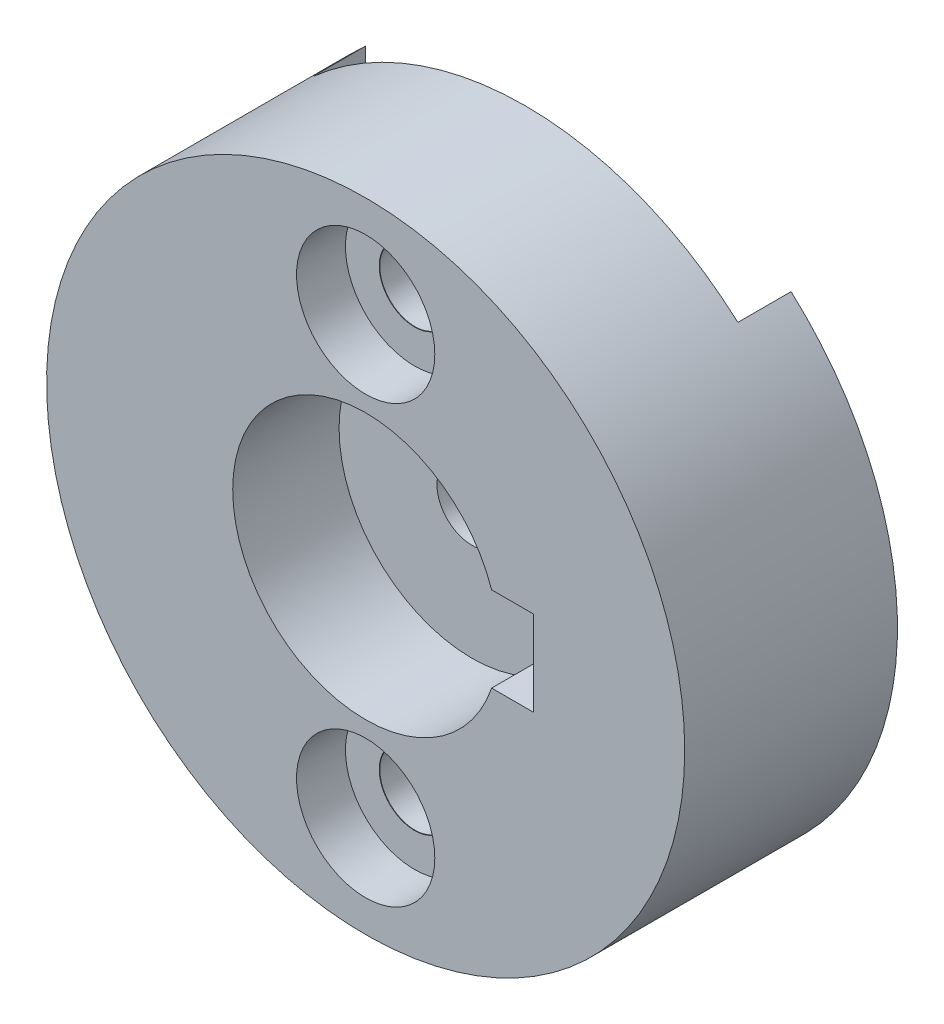
ISO-10303-21;
HEADER;
FILE_DESCRIPTION(('STEP AP214'),'2;1');
FILE_NAME('part.step','',(''),(''),'','','');
FILE_SCHEMA(('AUTOMOTIVE_DESIGN { 1 0 10303 214 1 1 1 1 }'));
ENDSEC;
DATA;
#1=APPLICATION_CONTEXT('core data for automotive mechanical design processes');
#2=APPLICATION_PROTOCOL_DEFINITION('international standard','automotive_design',2000,#1);
#3=PRODUCT_CONTEXT('',#1,'mechanical');
#4=PRODUCT('Part','Part','',(#3));
#5=PRODUCT_RELATED_PRODUCT_CATEGORY('part','',(#4));
#6=PRODUCT_DEFINITION_FORMATION('','',#4);
#7=PRODUCT_DEFINITION_CONTEXT('part definition',#1,'design');
#8=PRODUCT_DEFINITION('design','',#6,#7);
#9=PRODUCT_DEFINITION_SHAPE('','',#8);
#10=(LENGTH_UNIT() NAMED_UNIT(*) SI_UNIT(.MILLI.,.METRE.));
#11=(NAMED_UNIT(*) PLANE_ANGLE_UNIT() SI_UNIT($,.RADIAN.));
#12=(NAMED_UNIT(*) SI_UNIT($,.STERADIAN.) SOLID_ANGLE_UNIT());
#13=UNCERTAINTY_MEASURE_WITH_UNIT(LENGTH_MEASURE(1.E-05),#10,'distance_accuracy_value','');
#14=(GEOMETRIC_REPRESENTATION_CONTEXT(3) GLOBAL_UNCERTAINTY_ASSIGNED_CONTEXT((#13)) GLOBAL_UNIT_ASSIGNED_CONTEXT((#10,
#11,#12)) REPRESENTATION_CONTEXT('',''));
#15=CARTESIAN_POINT('',(0.,0.,0.));
#16=DIRECTION('',(0.,0.,1.));
#17=DIRECTION('',(1.,0.,0.));
#18=AXIS2_PLACEMENT_3D('',#15,#16,#17);
#19=CARTESIAN_POINT('',(0.,0.,0.));
#20=DIRECTION('',(0.,0.,1.));
#21=DIRECTION('',(1.,0.,0.));
#22=AXIS2_PLACEMENT_3D('',#19,#20,#21);
#23=PLANE('',#22);
#24=CARTESIAN_POINT('',(0.,0.,0.));
#25=DIRECTION('',(0.,0.,1.));
#26=DIRECTION('',(1.,0.,0.));
#27=AXIS2_PLACEMENT_3D('',#24,#25,#26);
#28=CIRCLE('',#27,30.);
#29=CARTESIAN_POINT('',(-20.,22.3606797749979,0.));
#30=VERTEX_POINT('',#29);
#31=CARTESIAN_POINT('',(-20.,-22.3606797749979,0.));
#32=VERTEX_POINT('',#31);
#33=EDGE_CURVE('E196',#30,#32,#28,.T.);
#34=ORIENTED_EDGE('',*,*,#33,.F.);
#35=DIRECTION('',(0.,-1.,0.));
#36=VECTOR('',#35,1.);
#37=CARTESIAN_POINT('',(-20.,0.,0.));
#38=LINE('',#37,#36);
#39=EDGE_CURVE('E200',#30,#32,#38,.T.);
#40=ORIENTED_EDGE('',*,*,#39,.T.);
#41=EDGE_LOOP('',(#34,#40));
#42=FACE_BOUND('',#41,.T.);
#43=ADVANCED_FACE('F33',(#42),#23,.F.);
#44=CARTESIAN_POINT('',(0.,0.,20.));
#45=DIRECTION('',(0.,0.,-1.));
#46=DIRECTION('',(-1.,0.,0.));
#47=AXIS2_PLACEMENT_3D('',#44,#45,#46);
#48=CYLINDRICAL_SURFACE('',#47,30.);
#49=CARTESIAN_POINT('',(0.,0.,5.));
#50=DIRECTION('',(0.,0.,1.));
#51=DIRECTION('',(1.,0.,0.));
#52=AXIS2_PLACEMENT_3D('',#49,#50,#51);
#53=CIRCLE('',#52,30.);
#54=CARTESIAN_POINT('',(20.,22.3606797749979,5.));
#55=VERTEX_POINT('',#54);
#56=CARTESIAN_POINT('',(-20.,22.3606797749979,5.));
#57=VERTEX_POINT('',#56);
#58=EDGE_CURVE('E11',#55,#57,#53,.T.);
#59=ORIENTED_EDGE('',*,*,#58,.T.);
#60=DIRECTION('',(0.,0.,-1.));
#61=VECTOR('',#60,1.);
#62=CARTESIAN_POINT('',(-20.,22.3606797749979,20.));
#63=LINE('',#62,#61);
#64=EDGE_CURVE('E188',#57,#30,#63,.T.);
#65=ORIENTED_EDGE('',*,*,#64,.T.);
#66=ORIENTED_EDGE('',*,*,#33,.T.);
#67=DIRECTION('',(0.,0.,-1.));
#68=VECTOR('',#67,1.);
#69=CARTESIAN_POINT('',(-20.,-22.3606797749979,20.));
#70=LINE('',#69,#68);
#71=CARTESIAN_POINT('',(-20.,-22.3606797749979,5.));
#72=VERTEX_POINT('',#71);
#73=EDGE_CURVE('E185',#32,#72,#70,.F.);
#74=ORIENTED_EDGE('',*,*,#73,.T.);
#75=CARTESIAN_POINT('',(20.,-22.3606797749979,5.));
#76=VERTEX_POINT('',#75);
#77=EDGE_CURVE('E42',#72,#76,#53,.T.);
#78=ORIENTED_EDGE('',*,*,#77,.T.);
#79=DIRECTION('',(0.,0.,-1.));
#80=VECTOR('',#79,1.);
#81=CARTESIAN_POINT('',(20.,-22.3606797749979,20.));
#82=LINE('',#81,#80);
#83=CARTESIAN_POINT('',(20.,-22.3606797749979,0.));
#84=VERTEX_POINT('',#83);
#85=EDGE_CURVE('E182',#76,#84,#82,.T.);
#86=ORIENTED_EDGE('',*,*,#85,.T.);
#87=CARTESIAN_POINT('',(20.,22.3606797749979,0.));
#88=VERTEX_POINT('',#87);
#89=EDGE_CURVE('E191',#84,#88,#28,.T.);
#90=ORIENTED_EDGE('',*,*,#89,.T.);
#91=DIRECTION('',(0.,0.,-1.));
#92=VECTOR('',#91,1.);
#93=CARTESIAN_POINT('',(20.,22.3606797749979,20.));
#94=LINE('',#93,#92);
#95=EDGE_CURVE('E58',#88,#55,#94,.F.);
#96=ORIENTED_EDGE('',*,*,#95,.T.);
#97=EDGE_LOOP('',(#59,#65,#66,#74,#78,#86,#90,#96));
#98=FACE_BOUND('',#97,.T.);
#99=CARTESIAN_POINT('',(0.,0.,20.));
#100=DIRECTION('',(0.,0.,1.));
#101=DIRECTION('',(1.,0.,0.));
#102=AXIS2_PLACEMENT_3D('',#99,#100,#101);
#103=CIRCLE('',#102,30.);
#104=CARTESIAN_POINT('',(30.,0.,20.));
#105=VERTEX_POINT('',#104);
#106=EDGE_CURVE('E192',#105,#105,#103,.T.);
#107=ORIENTED_EDGE('',*,*,#106,.F.);
#108=EDGE_LOOP('',(#107));
#109=FACE_BOUND('',#108,.T.);
#110=ADVANCED_FACE('F35',(#98,#109),#48,.T.);
#111=CARTESIAN_POINT('',(0.,0.,20.));
#112=DIRECTION('',(0.,0.,1.));
#113=DIRECTION('',(1.,0.,0.));
#114=AXIS2_PLACEMENT_3D('',#111,#112,#113);
#115=PLANE('',#114);
#116=DIRECTION('',(-1.,0.,0.));
#117=VECTOR('',#116,1.);
#118=CARTESIAN_POINT('',(9.8,4.,20.));
#119=LINE('',#118,#117);
#120=CARTESIAN_POINT('',(15.8,4.,20.));
#121=VERTEX_POINT('',#120);
#122=CARTESIAN_POINT('',(11.842719282327,4.,20.));
#123=VERTEX_POINT('',#122);
#124=EDGE_CURVE('E125',#121,#123,#119,.T.);
#125=ORIENTED_EDGE('',*,*,#124,.F.);
#126=DIRECTION('',(0.,1.,0.));
#127=VECTOR('',#126,1.);
#128=CARTESIAN_POINT('',(15.8,4.,20.));
#129=LINE('',#128,#127);
#130=CARTESIAN_POINT('',(15.8,-4.,20.));
#131=VERTEX_POINT('',#130);
#132=EDGE_CURVE('E128',#131,#121,#129,.T.);
#133=ORIENTED_EDGE('',*,*,#132,.F.);
#134=DIRECTION('',(1.,0.,0.));
#135=VECTOR('',#134,1.);
#136=CARTESIAN_POINT('',(9.8,-4.,20.));
#137=LINE('',#136,#135);
#138=CARTESIAN_POINT('',(11.842719282327,-4.,20.));
#139=VERTEX_POINT('',#138);
#140=EDGE_CURVE('E115',#139,#131,#137,.T.);
#141=ORIENTED_EDGE('',*,*,#140,.F.);
#142=CARTESIAN_POINT('',(0.,0.,20.));
#143=DIRECTION('',(0.,0.,1.));
#144=DIRECTION('',(1.,0.,0.));
#145=AXIS2_PLACEMENT_3D('',#142,#143,#144);
#146=CIRCLE('',#145,12.5);
#147=EDGE_CURVE('E171',#123,#139,#146,.T.);
#148=ORIENTED_EDGE('',*,*,#147,.F.);
#149=EDGE_LOOP('',(#125,#133,#141,#148));
#150=FACE_BOUND('',#149,.T.);
#151=CARTESIAN_POINT('',(0.,-20.5,20.));
#152=DIRECTION('',(0.,0.,1.));
#153=DIRECTION('',(1.,0.,0.));
#154=AXIS2_PLACEMENT_3D('',#151,#152,#153);
#155=CIRCLE('',#154,6.5);
#156=CARTESIAN_POINT('',(6.5,-20.5,20.));
#157=VERTEX_POINT('',#156);
#158=EDGE_CURVE('E136',#157,#157,#155,.T.);
#159=ORIENTED_EDGE('',*,*,#158,.F.);
#160=EDGE_LOOP('',(#159));
#161=FACE_BOUND('',#160,.T.);
#162=CARTESIAN_POINT('',(0.,20.5,20.));
#163=DIRECTION('',(0.,0.,1.));
#164=DIRECTION('',(1.,0.,0.));
#165=AXIS2_PLACEMENT_3D('',#162,#163,#164);
#166=CIRCLE('',#165,6.5);
#167=CARTESIAN_POINT('',(6.5,20.5,20.));
#168=VERTEX_POINT('',#167);
#169=EDGE_CURVE('E148',#168,#168,#166,.T.);
#170=ORIENTED_EDGE('',*,*,#169,.F.);
#171=EDGE_LOOP('',(#170));
#172=FACE_BOUND('',#171,.T.);
#173=ORIENTED_EDGE('',*,*,#106,.T.);
#174=EDGE_LOOP('',(#173));
#175=FACE_BOUND('',#174,.T.);
#176=ADVANCED_FACE('F233',(#150,#161,#172,#175),#115,.T.);
#177=ORIENTED_EDGE('',*,*,#89,.F.);
#178=DIRECTION('',(0.,1.,0.));
#179=VECTOR('',#178,1.);
#180=CARTESIAN_POINT('',(20.,0.,0.));
#181=LINE('',#180,#179);
#182=EDGE_CURVE('E195',#84,#88,#181,.T.);
#183=ORIENTED_EDGE('',*,*,#182,.T.);
#184=EDGE_LOOP('',(#177,#183));
#185=FACE_BOUND('',#184,.T.);
#186=ADVANCED_FACE('F229',(#185),#23,.F.);
#187=CARTESIAN_POINT('',(0.,0.,5.));
#188=DIRECTION('',(0.,0.,1.));
#189=DIRECTION('',(1.,0.,0.));
#190=AXIS2_PLACEMENT_3D('',#187,#188,#189);
#191=PLANE('',#190);
#192=CARTESIAN_POINT('',(0.,-20.5,5.));
#193=DIRECTION('',(0.,0.,1.));
#194=DIRECTION('',(1.,0.,0.));
#195=AXIS2_PLACEMENT_3D('',#192,#193,#194);
#196=CIRCLE('',#195,3.3);
#197=CARTESIAN_POINT('',(3.3,-20.5,5.));
#198=VERTEX_POINT('',#197);
#199=EDGE_CURVE('E37',#198,#198,#196,.T.);
#200=ORIENTED_EDGE('',*,*,#199,.T.);
#201=EDGE_LOOP('',(#200));
#202=FACE_BOUND('',#201,.T.);
#203=CARTESIAN_POINT('',(0.,20.5,5.));
#204=DIRECTION('',(0.,0.,1.));
#205=DIRECTION('',(1.,0.,0.));
#206=AXIS2_PLACEMENT_3D('',#203,#204,#205);
#207=CIRCLE('',#206,3.3);
#208=CARTESIAN_POINT('',(3.29999999999999,20.5,5.));
#209=VERTEX_POINT('',#208);
#210=EDGE_CURVE('E160',#209,#209,#207,.T.);
#211=ORIENTED_EDGE('',*,*,#210,.T.);
#212=EDGE_LOOP('',(#211));
#213=FACE_BOUND('',#212,.T.);
#214=CARTESIAN_POINT('',(0.,0.,5.));
#215=DIRECTION('',(0.,0.,-1.));
#216=DIRECTION('',(-1.,0.,0.));
#217=AXIS2_PLACEMENT_3D('',#214,#215,#216);
#218=CIRCLE('',#217,4.49999999999999);
#219=CARTESIAN_POINT('',(-4.49999999999999,0.,5.));
#220=VERTEX_POINT('',#219);
#221=EDGE_CURVE('E161',#220,#220,#218,.T.);
#222=ORIENTED_EDGE('',*,*,#221,.F.);
#223=EDGE_LOOP('',(#222));
#224=FACE_BOUND('',#223,.T.);
#225=DIRECTION('',(0.,-1.,0.));
#226=VECTOR('',#225,1.);
#227=CARTESIAN_POINT('',(20.,-39.3168152093466,5.));
#228=LINE('',#227,#226);
#229=EDGE_CURVE('E178',#55,#76,#228,.T.);
#230=ORIENTED_EDGE('',*,*,#229,.T.);
#231=ORIENTED_EDGE('',*,*,#77,.F.);
#232=DIRECTION('',(0.,1.,0.));
#233=VECTOR('',#232,1.);
#234=CARTESIAN_POINT('',(-20.,-39.3168152093466,5.));
#235=LINE('',#234,#233);
#236=EDGE_CURVE('E173',#72,#57,#235,.T.);
#237=ORIENTED_EDGE('',*,*,#236,.T.);
#238=ORIENTED_EDGE('',*,*,#58,.F.);
#239=EDGE_LOOP('',(#230,#231,#237,#238));
#240=FACE_BOUND('',#239,.T.);
#241=ADVANCED_FACE('F208',(#202,#213,#224,#240),#191,.F.);
#242=CARTESIAN_POINT('',(-20.,-39.3168152093466,5.));
#243=DIRECTION('',(-1.,0.,0.));
#244=DIRECTION('',(0.,0.,1.));
#245=AXIS2_PLACEMENT_3D('',#242,#243,#244);
#246=PLANE('',#245);
#247=ORIENTED_EDGE('',*,*,#236,.F.);
#248=ORIENTED_EDGE('',*,*,#73,.F.);
#249=ORIENTED_EDGE('',*,*,#39,.F.);
#250=ORIENTED_EDGE('',*,*,#64,.F.);
#251=EDGE_LOOP('',(#247,#248,#249,#250));
#252=FACE_BOUND('',#251,.T.);
#253=ADVANCED_FACE('F243',(#252),#246,.F.);
#254=CARTESIAN_POINT('',(20.,-39.3168152093466,5.));
#255=DIRECTION('',(1.,0.,0.));
#256=DIRECTION('',(0.,0.,-1.));
#257=AXIS2_PLACEMENT_3D('',#254,#255,#256);
#258=PLANE('',#257);
#259=ORIENTED_EDGE('',*,*,#229,.F.);
#260=ORIENTED_EDGE('',*,*,#95,.F.);
#261=ORIENTED_EDGE('',*,*,#182,.F.);
#262=ORIENTED_EDGE('',*,*,#85,.F.);
#263=EDGE_LOOP('',(#259,#260,#261,#262));
#264=FACE_BOUND('',#263,.T.);
#265=ADVANCED_FACE('F249',(#264),#258,.F.);
#266=CARTESIAN_POINT('',(0.,0.,10.));
#267=DIRECTION('',(0.,0.,1.));
#268=DIRECTION('',(1.,0.,0.));
#269=AXIS2_PLACEMENT_3D('',#266,#267,#268);
#270=CYLINDRICAL_SURFACE('',#269,12.5);
#271=CARTESIAN_POINT('',(0.,0.,10.));
#272=DIRECTION('',(0.,0.,1.));
#273=DIRECTION('',(1.,0.,0.));
#274=AXIS2_PLACEMENT_3D('',#271,#272,#273);
#275=CIRCLE('',#274,12.5);
#276=CARTESIAN_POINT('',(11.842719282327,4.,10.));
#277=VERTEX_POINT('',#276);
#278=CARTESIAN_POINT('',(11.842719282327,-4.,10.));
#279=VERTEX_POINT('',#278);
#280=EDGE_CURVE('E107',#277,#279,#275,.T.);
#281=ORIENTED_EDGE('',*,*,#280,.F.);
#282=DIRECTION('',(0.,0.,1.));
#283=VECTOR('',#282,1.);
#284=CARTESIAN_POINT('',(11.842719282327,4.,10.));
#285=LINE('',#284,#283);
#286=EDGE_CURVE('E133',#277,#123,#285,.T.);
#287=ORIENTED_EDGE('',*,*,#286,.T.);
#288=ORIENTED_EDGE('',*,*,#147,.T.);
#289=DIRECTION('',(0.,0.,1.));
#290=VECTOR('',#289,1.);
#291=CARTESIAN_POINT('',(11.842719282327,-4.,10.));
#292=LINE('',#291,#290);
#293=EDGE_CURVE('E130',#139,#279,#292,.F.);
#294=ORIENTED_EDGE('',*,*,#293,.T.);
#295=EDGE_LOOP('',(#281,#287,#288,#294));
#296=FACE_BOUND('',#295,.T.);
#297=ADVANCED_FACE('F259',(#296),#270,.F.);
#298=CARTESIAN_POINT('',(0.,0.,10.));
#299=DIRECTION('',(0.,0.,1.));
#300=DIRECTION('',(1.,0.,0.));
#301=AXIS2_PLACEMENT_3D('',#298,#299,#300);
#302=PLANE('',#301);
#303=ORIENTED_EDGE('',*,*,#280,.T.);
#304=DIRECTION('',(1.,0.,0.));
#305=VECTOR('',#304,1.);
#306=CARTESIAN_POINT('',(9.8,-4.,10.));
#307=LINE('',#306,#305);
#308=CARTESIAN_POINT('',(15.8,-4.,10.));
#309=VERTEX_POINT('',#308);
#310=EDGE_CURVE('E100',#279,#309,#307,.T.);
#311=ORIENTED_EDGE('',*,*,#310,.T.);
#312=DIRECTION('',(0.,1.,0.));
#313=VECTOR('',#312,1.);
#314=CARTESIAN_POINT('',(15.8,4.,10.));
#315=LINE('',#314,#313);
#316=CARTESIAN_POINT('',(15.8,4.,10.));
#317=VERTEX_POINT('',#316);
#318=EDGE_CURVE('E105',#309,#317,#315,.T.);
#319=ORIENTED_EDGE('',*,*,#318,.T.);
#320=DIRECTION('',(-1.,0.,0.));
#321=VECTOR('',#320,1.);
#322=CARTESIAN_POINT('',(9.8,4.,10.));
#323=LINE('',#322,#321);
#324=EDGE_CURVE('E50',#317,#277,#323,.T.);
#325=ORIENTED_EDGE('',*,*,#324,.T.);
#326=EDGE_LOOP('',(#303,#311,#319,#325));
#327=FACE_BOUND('',#326,.T.);
#328=CARTESIAN_POINT('',(0.,0.,10.));
#329=DIRECTION('',(0.,0.,1.));
#330=DIRECTION('',(1.,0.,0.));
#331=AXIS2_PLACEMENT_3D('',#328,#329,#330);
#332=CIRCLE('',#331,3.29999999999999);
#333=CARTESIAN_POINT('',(3.29999999999999,0.,10.));
#334=VERTEX_POINT('',#333);
#335=EDGE_CURVE('E168',#334,#334,#332,.T.);
#336=ORIENTED_EDGE('',*,*,#335,.F.);
#337=EDGE_LOOP('',(#336));
#338=FACE_BOUND('',#337,.T.);
#339=ADVANCED_FACE('F102',(#327,#338),#302,.T.);
#340=CARTESIAN_POINT('',(0.,0.,10.));
#341=DIRECTION('',(0.,0.,1.));
#342=DIRECTION('',(1.,0.,0.));
#343=AXIS2_PLACEMENT_3D('',#340,#341,#342);
#344=CYLINDRICAL_SURFACE('',#343,3.29999999999999);
#345=CARTESIAN_POINT('',(0.,0.,8.1));
#346=DIRECTION('',(0.,0.,1.));
#347=DIRECTION('',(1.,0.,0.));
#348=AXIS2_PLACEMENT_3D('',#345,#346,#347);
#349=CIRCLE('',#348,3.29999999999999);
#350=CARTESIAN_POINT('',(3.29999999999999,0.,8.1));
#351=VERTEX_POINT('',#350);
#352=EDGE_CURVE('E167',#351,#351,#349,.F.);
#353=ORIENTED_EDGE('',*,*,#352,.T.);
#354=EDGE_LOOP('',(#353));
#355=FACE_BOUND('',#354,.T.);
#356=ORIENTED_EDGE('',*,*,#335,.T.);
#357=EDGE_LOOP('',(#356));
#358=FACE_BOUND('',#357,.T.);
#359=ADVANCED_FACE('F267',(#355,#358),#344,.F.);
#360=CARTESIAN_POINT('',(2.275,0.,8.1));
#361=DIRECTION('',(0.,0.,1.));
#362=DIRECTION('',(1.,0.,0.));
#363=AXIS2_PLACEMENT_3D('',#360,#361,#362);
#364=PLANE('',#363);
#365=CARTESIAN_POINT('',(0.,0.,8.1));
#366=DIRECTION('',(0.,0.,-1.));
#367=DIRECTION('',(-1.,0.,0.));
#368=AXIS2_PLACEMENT_3D('',#365,#366,#367);
#369=CIRCLE('',#368,4.49999999999999);
#370=CARTESIAN_POINT('',(-4.49999999999999,0.,8.1));
#371=VERTEX_POINT('',#370);
#372=EDGE_CURVE('E164',#371,#371,#369,.T.);
#373=ORIENTED_EDGE('',*,*,#372,.T.);
#374=EDGE_LOOP('',(#373));
#375=FACE_BOUND('',#374,.T.);
#376=ORIENTED_EDGE('',*,*,#352,.F.);
#377=EDGE_LOOP('',(#376));
#378=FACE_BOUND('',#377,.T.);
#379=ADVANCED_FACE('F224',(#375,#378),#364,.F.);
#380=CARTESIAN_POINT('',(0.,0.,5.));
#381=DIRECTION('',(0.,0.,-1.));
#382=DIRECTION('',(-1.,0.,0.));
#383=AXIS2_PLACEMENT_3D('',#380,#381,#382);
#384=CYLINDRICAL_SURFACE('',#383,4.49999999999999);
#385=ORIENTED_EDGE('',*,*,#372,.F.);
#386=EDGE_LOOP('',(#385));
#387=FACE_BOUND('',#386,.T.);
#388=ORIENTED_EDGE('',*,*,#221,.T.);
#389=EDGE_LOOP('',(#388));
#390=FACE_BOUND('',#389,.T.);
#391=ADVANCED_FACE('F214',(#387,#390),#384,.F.);
#392=CARTESIAN_POINT('',(0.,20.5,20.));
#393=DIRECTION('',(0.,0.,1.));
#394=DIRECTION('',(1.,0.,0.));
#395=AXIS2_PLACEMENT_3D('',#392,#393,#394);
#396=CYLINDRICAL_SURFACE('',#395,3.3);
#397=CARTESIAN_POINT('',(0.,20.5,15.375));
#398=DIRECTION('',(0.,0.,1.));
#399=DIRECTION('',(1.,0.,0.));
#400=AXIS2_PLACEMENT_3D('',#397,#398,#399);
#401=CIRCLE('',#400,3.3);
#402=CARTESIAN_POINT('',(3.3,20.5,15.375));
#403=VERTEX_POINT('',#402);
#404=EDGE_CURVE('E157',#403,#403,#401,.T.);
#405=ORIENTED_EDGE('',*,*,#404,.T.);
#406=EDGE_LOOP('',(#405));
#407=FACE_BOUND('',#406,.T.);
#408=ORIENTED_EDGE('',*,*,#210,.F.);
#409=EDGE_LOOP('',(#408));
#410=FACE_BOUND('',#409,.T.);
#411=ADVANCED_FACE('F211',(#407,#410),#396,.F.);
#412=CARTESIAN_POINT('',(0.,20.5,15.4));
#413=DIRECTION('',(0.,0.,1.));
#414=DIRECTION('',(1.,0.,0.));
#415=AXIS2_PLACEMENT_3D('',#412,#413,#414);
#416=CONICAL_SURFACE('',#415,3.325,0.785398163397414);
#417=ORIENTED_EDGE('',*,*,#404,.F.);
#418=EDGE_LOOP('',(#417));
#419=FACE_BOUND('',#418,.T.);
#420=CARTESIAN_POINT('',(0.,20.5,15.4));
#421=DIRECTION('',(0.,0.,1.));
#422=DIRECTION('',(1.,0.,0.));
#423=AXIS2_PLACEMENT_3D('',#420,#421,#422);
#424=CIRCLE('',#423,3.325);
#425=CARTESIAN_POINT('',(3.325,20.5,15.4));
#426=VERTEX_POINT('',#425);
#427=EDGE_CURVE('E154',#426,#426,#424,.T.);
#428=ORIENTED_EDGE('',*,*,#427,.T.);
#429=EDGE_LOOP('',(#428));
#430=FACE_BOUND('',#429,.T.);
#431=ADVANCED_FACE('F213',(#419,#430),#416,.F.);
#432=CARTESIAN_POINT('',(3.325,20.5,15.4));
#433=DIRECTION('',(0.,0.,-1.));
#434=DIRECTION('',(-1.,0.,0.));
#435=AXIS2_PLACEMENT_3D('',#432,#433,#434);
#436=PLANE('',#435);
#437=ORIENTED_EDGE('',*,*,#427,.F.);
#438=EDGE_LOOP('',(#437));
#439=FACE_BOUND('',#438,.T.);
#440=CARTESIAN_POINT('',(0.,20.5,15.4));
#441=DIRECTION('',(0.,0.,1.));
#442=DIRECTION('',(1.,0.,0.));
#443=AXIS2_PLACEMENT_3D('',#440,#441,#442);
#444=CIRCLE('',#443,6.5);
#445=CARTESIAN_POINT('',(6.5,20.5,15.4));
#446=VERTEX_POINT('',#445);
#447=EDGE_CURVE('E151',#446,#446,#444,.T.);
#448=ORIENTED_EDGE('',*,*,#447,.T.);
#449=EDGE_LOOP('',(#448));
#450=FACE_BOUND('',#449,.T.);
#451=ADVANCED_FACE('F221',(#439,#450),#436,.F.);
#452=CARTESIAN_POINT('',(0.,20.5,20.));
#453=DIRECTION('',(0.,0.,1.));
#454=DIRECTION('',(1.,0.,0.));
#455=AXIS2_PLACEMENT_3D('',#452,#453,#454);
#456=CYLINDRICAL_SURFACE('',#455,6.5);
#457=ORIENTED_EDGE('',*,*,#447,.F.);
#458=EDGE_LOOP('',(#457));
#459=FACE_BOUND('',#458,.T.);
#460=ORIENTED_EDGE('',*,*,#169,.T.);
#461=EDGE_LOOP('',(#460));
#462=FACE_BOUND('',#461,.T.);
#463=ADVANCED_FACE('F315',(#459,#462),#456,.F.);
#464=CARTESIAN_POINT('',(0.,-20.5,20.));
#465=DIRECTION('',(0.,0.,1.));
#466=DIRECTION('',(1.,0.,0.));
#467=AXIS2_PLACEMENT_3D('',#464,#465,#466);
#468=CYLINDRICAL_SURFACE('',#467,3.3);
#469=CARTESIAN_POINT('',(0.,-20.5,15.375));
#470=DIRECTION('',(0.,0.,1.));
#471=DIRECTION('',(1.,0.,0.));
#472=AXIS2_PLACEMENT_3D('',#469,#470,#471);
#473=CIRCLE('',#472,3.3);
#474=CARTESIAN_POINT('',(3.3,-20.5,15.375));
#475=VERTEX_POINT('',#474);
#476=EDGE_CURVE('E145',#475,#475,#473,.T.);
#477=ORIENTED_EDGE('',*,*,#476,.T.);
#478=EDGE_LOOP('',(#477));
#479=FACE_BOUND('',#478,.T.);
#480=ORIENTED_EDGE('',*,*,#199,.F.);
#481=EDGE_LOOP('',(#480));
#482=FACE_BOUND('',#481,.T.);
#483=ADVANCED_FACE('F325',(#479,#482),#468,.F.);
#484=CARTESIAN_POINT('',(0.,-20.5,15.4));
#485=DIRECTION('',(0.,0.,1.));
#486=DIRECTION('',(1.,0.,0.));
#487=AXIS2_PLACEMENT_3D('',#484,#485,#486);
#488=CONICAL_SURFACE('',#487,3.325,0.785398163397414);
#489=ORIENTED_EDGE('',*,*,#476,.F.);
#490=EDGE_LOOP('',(#489));
#491=FACE_BOUND('',#490,.T.);
#492=CARTESIAN_POINT('',(0.,-20.5,15.4));
#493=DIRECTION('',(0.,0.,1.));
#494=DIRECTION('',(1.,0.,0.));
#495=AXIS2_PLACEMENT_3D('',#492,#493,#494);
#496=CIRCLE('',#495,3.325);
#497=CARTESIAN_POINT('',(3.325,-20.5,15.4));
#498=VERTEX_POINT('',#497);
#499=EDGE_CURVE('E142',#498,#498,#496,.T.);
#500=ORIENTED_EDGE('',*,*,#499,.T.);
#501=EDGE_LOOP('',(#500));
#502=FACE_BOUND('',#501,.T.);
#503=ADVANCED_FACE('F335',(#491,#502),#488,.F.);
#504=CARTESIAN_POINT('',(3.325,-20.5,15.4));
#505=DIRECTION('',(0.,0.,-1.));
#506=DIRECTION('',(-1.,0.,0.));
#507=AXIS2_PLACEMENT_3D('',#504,#505,#506);
#508=PLANE('',#507);
#509=ORIENTED_EDGE('',*,*,#499,.F.);
#510=EDGE_LOOP('',(#509));
#511=FACE_BOUND('',#510,.T.);
#512=CARTESIAN_POINT('',(0.,-20.5,15.4));
#513=DIRECTION('',(0.,0.,1.));
#514=DIRECTION('',(1.,0.,0.));
#515=AXIS2_PLACEMENT_3D('',#512,#513,#514);
#516=CIRCLE('',#515,6.5);
#517=CARTESIAN_POINT('',(6.5,-20.5,15.4));
#518=VERTEX_POINT('',#517);
#519=EDGE_CURVE('E139',#518,#518,#516,.T.);
#520=ORIENTED_EDGE('',*,*,#519,.T.);
#521=EDGE_LOOP('',(#520));
#522=FACE_BOUND('',#521,.T.);
#523=ADVANCED_FACE('F345',(#511,#522),#508,.F.);
#524=CARTESIAN_POINT('',(0.,-20.5,20.));
#525=DIRECTION('',(0.,0.,1.));
#526=DIRECTION('',(1.,0.,0.));
#527=AXIS2_PLACEMENT_3D('',#524,#525,#526);
#528=CYLINDRICAL_SURFACE('',#527,6.5);
#529=ORIENTED_EDGE('',*,*,#519,.F.);
#530=EDGE_LOOP('',(#529));
#531=FACE_BOUND('',#530,.T.);
#532=ORIENTED_EDGE('',*,*,#158,.T.);
#533=EDGE_LOOP('',(#532));
#534=FACE_BOUND('',#533,.T.);
#535=ADVANCED_FACE('F355',(#531,#534),#528,.F.);
#536=CARTESIAN_POINT('',(9.8,4.,10.));
#537=DIRECTION('',(0.,1.,0.));
#538=DIRECTION('',(-1.,0.,0.));
#539=AXIS2_PLACEMENT_3D('',#536,#537,#538);
#540=PLANE('',#539);
#541=ORIENTED_EDGE('',*,*,#324,.F.);
#542=DIRECTION('',(0.,0.,1.));
#543=VECTOR('',#542,1.);
#544=CARTESIAN_POINT('',(15.8,4.,10.));
#545=LINE('',#544,#543);
#546=EDGE_CURVE('E119',#317,#121,#545,.T.);
#547=ORIENTED_EDGE('',*,*,#546,.T.);
#548=ORIENTED_EDGE('',*,*,#124,.T.);
#549=ORIENTED_EDGE('',*,*,#286,.F.);
#550=EDGE_LOOP('',(#541,#547,#548,#549));
#551=FACE_BOUND('',#550,.T.);
#552=ADVANCED_FACE('F365',(#551),#540,.F.);
#553=CARTESIAN_POINT('',(9.8,-4.,10.));
#554=DIRECTION('',(0.,-1.,0.));
#555=DIRECTION('',(1.,0.,0.));
#556=AXIS2_PLACEMENT_3D('',#553,#554,#555);
#557=PLANE('',#556);
#558=ORIENTED_EDGE('',*,*,#140,.T.);
#559=DIRECTION('',(0.,0.,1.));
#560=VECTOR('',#559,1.);
#561=CARTESIAN_POINT('',(15.8,-4.,10.));
#562=LINE('',#561,#560);
#563=EDGE_CURVE('E112',#309,#131,#562,.T.);
#564=ORIENTED_EDGE('',*,*,#563,.F.);
#565=ORIENTED_EDGE('',*,*,#310,.F.);
#566=ORIENTED_EDGE('',*,*,#293,.F.);
#567=EDGE_LOOP('',(#558,#564,#565,#566));
#568=FACE_BOUND('',#567,.T.);
#569=ADVANCED_FACE('F113',(#568),#557,.F.);
#570=CARTESIAN_POINT('',(15.8,4.,10.));
#571=DIRECTION('',(1.,0.,0.));
#572=DIRECTION('',(0.,1.,0.));
#573=AXIS2_PLACEMENT_3D('',#570,#571,#572);
#574=PLANE('',#573);
#575=ORIENTED_EDGE('',*,*,#132,.T.);
#576=ORIENTED_EDGE('',*,*,#546,.F.);
#577=ORIENTED_EDGE('',*,*,#318,.F.);
#578=ORIENTED_EDGE('',*,*,#563,.T.);
#579=EDGE_LOOP('',(#575,#576,#577,#578));
#580=FACE_BOUND('',#579,.T.);
#581=ADVANCED_FACE('F121',(#580),#574,.F.);
#582=CLOSED_SHELL('',(#43,#110,#176,#186,#241,#253,#265,#297,#339,#359,#379,#391,#411,#431,#451,
#463,#483,#503,#523,#535,#552,#569,#581));
#583=MANIFOLD_SOLID_BREP('B2',#582);
#584=ADVANCED_BREP_SHAPE_REPRESENTATION('',(#18,#583),#14);
#585=SHAPE_DEFINITION_REPRESENTATION(#9,#584);
ENDSEC;
END-ISO-10303-21;
